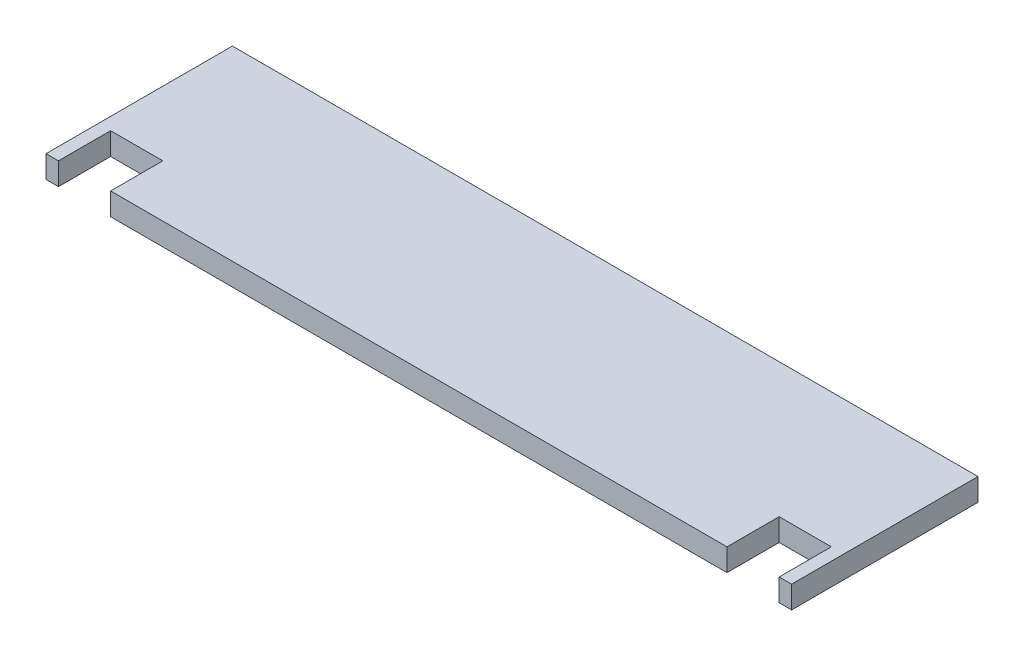
ISO-10303-21;
HEADER;
FILE_DESCRIPTION(('STEP AP214'),'2;1');
FILE_NAME('part.step','',(''),(''),'','','');
FILE_SCHEMA(('AUTOMOTIVE_DESIGN { 1 0 10303 214 1 1 1 1 }'));
ENDSEC;
DATA;
#1=APPLICATION_CONTEXT('core data for automotive mechanical design processes');
#2=APPLICATION_PROTOCOL_DEFINITION('international standard','automotive_design',2000,#1);
#3=PRODUCT_CONTEXT('',#1,'mechanical');
#4=PRODUCT('Part','Part','',(#3));
#5=PRODUCT_RELATED_PRODUCT_CATEGORY('part','',(#4));
#6=PRODUCT_DEFINITION_FORMATION('','',#4);
#7=PRODUCT_DEFINITION_CONTEXT('part definition',#1,'design');
#8=PRODUCT_DEFINITION('design','',#6,#7);
#9=PRODUCT_DEFINITION_SHAPE('','',#8);
#10=(LENGTH_UNIT() NAMED_UNIT(*) SI_UNIT(.MILLI.,.METRE.));
#11=(NAMED_UNIT(*) PLANE_ANGLE_UNIT() SI_UNIT($,.RADIAN.));
#12=(NAMED_UNIT(*) SI_UNIT($,.STERADIAN.) SOLID_ANGLE_UNIT());
#13=UNCERTAINTY_MEASURE_WITH_UNIT(LENGTH_MEASURE(1.E-05),#10,'distance_accuracy_value','');
#14=(GEOMETRIC_REPRESENTATION_CONTEXT(3) GLOBAL_UNCERTAINTY_ASSIGNED_CONTEXT((#13)) GLOBAL_UNIT_ASSIGNED_CONTEXT((#10,
#11,#12)) REPRESENTATION_CONTEXT('',''));
#15=CARTESIAN_POINT('',(0.,0.,0.));
#16=DIRECTION('',(0.,0.,1.));
#17=DIRECTION('',(1.,0.,0.));
#18=AXIS2_PLACEMENT_3D('',#15,#16,#17);
#19=CARTESIAN_POINT('',(-300.,18.,75.));
#20=DIRECTION('',(0.,0.,-1.));
#21=DIRECTION('',(-1.,0.,0.));
#22=AXIS2_PLACEMENT_3D('',#19,#20,#21);
#23=PLANE('',#22);
#24=DIRECTION('',(1.,0.,0.));
#25=VECTOR('',#24,1.);
#26=CARTESIAN_POINT('',(-300.,0.,75.));
#27=LINE('',#26,#25);
#28=CARTESIAN_POINT('',(-300.,0.,75.));
#29=VERTEX_POINT('',#28);
#30=CARTESIAN_POINT('',(-290.,0.,75.));
#31=VERTEX_POINT('',#30);
#32=EDGE_CURVE('E170',#29,#31,#27,.T.);
#33=ORIENTED_EDGE('',*,*,#32,.T.);
#34=DIRECTION('',(0.,1.,0.));
#35=VECTOR('',#34,1.);
#36=CARTESIAN_POINT('',(-290.,-2.,75.));
#37=LINE('',#36,#35);
#38=CARTESIAN_POINT('',(-290.,18.,75.));
#39=VERTEX_POINT('',#38);
#40=EDGE_CURVE('E165',#31,#39,#37,.T.);
#41=ORIENTED_EDGE('',*,*,#40,.T.);
#42=DIRECTION('',(1.,0.,0.));
#43=VECTOR('',#42,1.);
#44=CARTESIAN_POINT('',(-300.,18.,75.));
#45=LINE('',#44,#43);
#46=CARTESIAN_POINT('',(-300.,18.,75.));
#47=VERTEX_POINT('',#46);
#48=EDGE_CURVE('E152',#47,#39,#45,.T.);
#49=ORIENTED_EDGE('',*,*,#48,.F.);
#50=DIRECTION('',(0.,-1.,0.));
#51=VECTOR('',#50,1.);
#52=CARTESIAN_POINT('',(-300.,18.,75.));
#53=LINE('',#52,#51);
#54=EDGE_CURVE('E177',#47,#29,#53,.T.);
#55=ORIENTED_EDGE('',*,*,#54,.T.);
#56=EDGE_LOOP('',(#33,#41,#49,#55));
#57=FACE_BOUND('',#56,.T.);
#58=ADVANCED_FACE('F39',(#57),#23,.F.);
#59=CARTESIAN_POINT('',(-248.,18.,75.));
#60=VERTEX_POINT('',#59);
#61=CARTESIAN_POINT('',(248.,18.,75.));
#62=VERTEX_POINT('',#61);
#63=EDGE_CURVE('E144',#60,#62,#45,.T.);
#64=ORIENTED_EDGE('',*,*,#63,.F.);
#65=DIRECTION('',(0.,1.,0.));
#66=VECTOR('',#65,1.);
#67=CARTESIAN_POINT('',(-248.,-2.,75.));
#68=LINE('',#67,#66);
#69=CARTESIAN_POINT('',(-248.,0.,75.));
#70=VERTEX_POINT('',#69);
#71=EDGE_CURVE('E126',#70,#60,#68,.T.);
#72=ORIENTED_EDGE('',*,*,#71,.F.);
#73=CARTESIAN_POINT('',(248.,0.,75.));
#74=VERTEX_POINT('',#73);
#75=EDGE_CURVE('E174',#70,#74,#27,.T.);
#76=ORIENTED_EDGE('',*,*,#75,.T.);
#77=DIRECTION('',(0.,1.,0.));
#78=VECTOR('',#77,1.);
#79=CARTESIAN_POINT('',(248.,-2.,75.));
#80=LINE('',#79,#78);
#81=EDGE_CURVE('E151',#74,#62,#80,.T.);
#82=ORIENTED_EDGE('',*,*,#81,.T.);
#83=EDGE_LOOP('',(#64,#72,#76,#82));
#84=FACE_BOUND('',#83,.T.);
#85=ADVANCED_FACE('F150',(#84),#23,.F.);
#86=CARTESIAN_POINT('',(300.,18.,-75.));
#87=DIRECTION('',(-1.,0.,0.));
#88=DIRECTION('',(0.,0.,1.));
#89=AXIS2_PLACEMENT_3D('',#86,#87,#88);
#90=PLANE('',#89);
#91=DIRECTION('',(0.,0.,-1.));
#92=VECTOR('',#91,1.);
#93=CARTESIAN_POINT('',(300.,0.,-75.));
#94=LINE('',#93,#92);
#95=CARTESIAN_POINT('',(300.,0.,75.));
#96=VERTEX_POINT('',#95);
#97=CARTESIAN_POINT('',(300.,0.,-75.));
#98=VERTEX_POINT('',#97);
#99=EDGE_CURVE('E161',#96,#98,#94,.T.);
#100=ORIENTED_EDGE('',*,*,#99,.T.);
#101=DIRECTION('',(0.,-1.,0.));
#102=VECTOR('',#101,1.);
#103=CARTESIAN_POINT('',(300.,18.,-75.));
#104=LINE('',#103,#102);
#105=CARTESIAN_POINT('',(300.,18.,-75.));
#106=VERTEX_POINT('',#105);
#107=EDGE_CURVE('E183',#106,#98,#104,.T.);
#108=ORIENTED_EDGE('',*,*,#107,.F.);
#109=DIRECTION('',(0.,0.,-1.));
#110=VECTOR('',#109,1.);
#111=CARTESIAN_POINT('',(300.,18.,-75.));
#112=LINE('',#111,#110);
#113=CARTESIAN_POINT('',(300.,18.,75.));
#114=VERTEX_POINT('',#113);
#115=EDGE_CURVE('E173',#114,#106,#112,.T.);
#116=ORIENTED_EDGE('',*,*,#115,.F.);
#117=DIRECTION('',(0.,-1.,0.));
#118=VECTOR('',#117,1.);
#119=CARTESIAN_POINT('',(300.,18.,75.));
#120=LINE('',#119,#118);
#121=EDGE_CURVE('E156',#114,#96,#120,.T.);
#122=ORIENTED_EDGE('',*,*,#121,.T.);
#123=EDGE_LOOP('',(#100,#108,#116,#122));
#124=FACE_BOUND('',#123,.T.);
#125=ADVANCED_FACE('F41',(#124),#90,.F.);
#126=CARTESIAN_POINT('',(-300.,18.,-75.));
#127=DIRECTION('',(0.,0.,1.));
#128=DIRECTION('',(1.,0.,0.));
#129=AXIS2_PLACEMENT_3D('',#126,#127,#128);
#130=PLANE('',#129);
#131=DIRECTION('',(-1.,0.,0.));
#132=VECTOR('',#131,1.);
#133=CARTESIAN_POINT('',(-300.,0.,-75.));
#134=LINE('',#133,#132);
#135=CARTESIAN_POINT('',(-300.,0.,-75.));
#136=VERTEX_POINT('',#135);
#137=EDGE_CURVE('E164',#98,#136,#134,.T.);
#138=ORIENTED_EDGE('',*,*,#137,.T.);
#139=DIRECTION('',(0.,-1.,0.));
#140=VECTOR('',#139,1.);
#141=CARTESIAN_POINT('',(-300.,18.,-75.));
#142=LINE('',#141,#140);
#143=CARTESIAN_POINT('',(-300.,18.,-75.));
#144=VERTEX_POINT('',#143);
#145=EDGE_CURVE('E180',#144,#136,#142,.T.);
#146=ORIENTED_EDGE('',*,*,#145,.F.);
#147=DIRECTION('',(-1.,0.,0.));
#148=VECTOR('',#147,1.);
#149=CARTESIAN_POINT('',(-300.,18.,-75.));
#150=LINE('',#149,#148);
#151=EDGE_CURVE('E223',#106,#144,#150,.T.);
#152=ORIENTED_EDGE('',*,*,#151,.F.);
#153=ORIENTED_EDGE('',*,*,#107,.T.);
#154=EDGE_LOOP('',(#138,#146,#152,#153));
#155=FACE_BOUND('',#154,.T.);
#156=ADVANCED_FACE('F259',(#155),#130,.F.);
#157=CARTESIAN_POINT('',(-300.,18.,-75.));
#158=DIRECTION('',(1.,0.,0.));
#159=DIRECTION('',(0.,0.,-1.));
#160=AXIS2_PLACEMENT_3D('',#157,#158,#159);
#161=PLANE('',#160);
#162=DIRECTION('',(0.,0.,1.));
#163=VECTOR('',#162,1.);
#164=CARTESIAN_POINT('',(-300.,0.,-75.));
#165=LINE('',#164,#163);
#166=EDGE_CURVE('E167',#136,#29,#165,.T.);
#167=ORIENTED_EDGE('',*,*,#166,.T.);
#168=ORIENTED_EDGE('',*,*,#54,.F.);
#169=DIRECTION('',(0.,0.,1.));
#170=VECTOR('',#169,1.);
#171=CARTESIAN_POINT('',(-300.,18.,-75.));
#172=LINE('',#171,#170);
#173=EDGE_CURVE('E157',#144,#47,#172,.T.);
#174=ORIENTED_EDGE('',*,*,#173,.F.);
#175=ORIENTED_EDGE('',*,*,#145,.T.);
#176=EDGE_LOOP('',(#167,#168,#174,#175));
#177=FACE_BOUND('',#176,.T.);
#178=ADVANCED_FACE('F229',(#177),#161,.F.);
#179=CARTESIAN_POINT('',(290.,18.,75.));
#180=VERTEX_POINT('',#179);
#181=EDGE_CURVE('E153',#180,#114,#45,.T.);
#182=ORIENTED_EDGE('',*,*,#181,.F.);
#183=DIRECTION('',(0.,1.,0.));
#184=VECTOR('',#183,1.);
#185=CARTESIAN_POINT('',(290.,-2.,75.));
#186=LINE('',#185,#184);
#187=CARTESIAN_POINT('',(290.,0.,75.));
#188=VERTEX_POINT('',#187);
#189=EDGE_CURVE('E210',#188,#180,#186,.T.);
#190=ORIENTED_EDGE('',*,*,#189,.F.);
#191=EDGE_CURVE('E169',#188,#96,#27,.T.);
#192=ORIENTED_EDGE('',*,*,#191,.T.);
#193=ORIENTED_EDGE('',*,*,#121,.F.);
#194=EDGE_LOOP('',(#182,#190,#192,#193));
#195=FACE_BOUND('',#194,.T.);
#196=ADVANCED_FACE('F246',(#195),#23,.F.);
#197=CARTESIAN_POINT('',(0.,18.,0.));
#198=DIRECTION('',(0.,1.,0.));
#199=DIRECTION('',(0.,0.,1.));
#200=AXIS2_PLACEMENT_3D('',#197,#198,#199);
#201=PLANE('',#200);
#202=DIRECTION('',(0.,0.,1.));
#203=VECTOR('',#202,1.);
#204=CARTESIAN_POINT('',(-290.,18.,33.));
#205=LINE('',#204,#203);
#206=CARTESIAN_POINT('',(-290.,18.,33.));
#207=VERTEX_POINT('',#206);
#208=EDGE_CURVE('E137',#207,#39,#205,.T.);
#209=ORIENTED_EDGE('',*,*,#208,.F.);
#210=DIRECTION('',(-1.,0.,0.));
#211=VECTOR('',#210,1.);
#212=CARTESIAN_POINT('',(-290.,18.,33.));
#213=LINE('',#212,#211);
#214=CARTESIAN_POINT('',(-248.,18.,33.));
#215=VERTEX_POINT('',#214);
#216=EDGE_CURVE('E146',#215,#207,#213,.T.);
#217=ORIENTED_EDGE('',*,*,#216,.F.);
#218=DIRECTION('',(0.,0.,-1.));
#219=VECTOR('',#218,1.);
#220=CARTESIAN_POINT('',(-248.,18.,33.));
#221=LINE('',#220,#219);
#222=EDGE_CURVE('E129',#60,#215,#221,.T.);
#223=ORIENTED_EDGE('',*,*,#222,.F.);
#224=ORIENTED_EDGE('',*,*,#63,.T.);
#225=DIRECTION('',(0.,0.,1.));
#226=VECTOR('',#225,1.);
#227=CARTESIAN_POINT('',(248.,18.,33.));
#228=LINE('',#227,#226);
#229=CARTESIAN_POINT('',(248.,18.,33.));
#230=VERTEX_POINT('',#229);
#231=EDGE_CURVE('E212',#230,#62,#228,.T.);
#232=ORIENTED_EDGE('',*,*,#231,.F.);
#233=DIRECTION('',(-1.,0.,0.));
#234=VECTOR('',#233,1.);
#235=CARTESIAN_POINT('',(290.,18.,33.));
#236=LINE('',#235,#234);
#237=CARTESIAN_POINT('',(290.,18.,33.));
#238=VERTEX_POINT('',#237);
#239=EDGE_CURVE('E218',#238,#230,#236,.T.);
#240=ORIENTED_EDGE('',*,*,#239,.F.);
#241=DIRECTION('',(0.,0.,-1.));
#242=VECTOR('',#241,1.);
#243=CARTESIAN_POINT('',(290.,18.,33.));
#244=LINE('',#243,#242);
#245=EDGE_CURVE('E147',#180,#238,#244,.T.);
#246=ORIENTED_EDGE('',*,*,#245,.F.);
#247=ORIENTED_EDGE('',*,*,#181,.T.);
#248=ORIENTED_EDGE('',*,*,#115,.T.);
#249=ORIENTED_EDGE('',*,*,#151,.T.);
#250=ORIENTED_EDGE('',*,*,#173,.T.);
#251=ORIENTED_EDGE('',*,*,#48,.T.);
#252=EDGE_LOOP('',(#209,#217,#223,#224,#232,#240,#246,#247,#248,#249,#250,#251));
#253=FACE_BOUND('',#252,.T.);
#254=ADVANCED_FACE('F142',(#253),#201,.T.);
#255=CARTESIAN_POINT('',(0.,0.,0.));
#256=DIRECTION('',(0.,1.,0.));
#257=DIRECTION('',(0.,0.,1.));
#258=AXIS2_PLACEMENT_3D('',#255,#256,#257);
#259=PLANE('',#258);
#260=DIRECTION('',(-1.,0.,0.));
#261=VECTOR('',#260,1.);
#262=CARTESIAN_POINT('',(0.,0.,33.));
#263=LINE('',#262,#261);
#264=CARTESIAN_POINT('',(-248.,0.,33.));
#265=VERTEX_POINT('',#264);
#266=CARTESIAN_POINT('',(-290.,0.,33.));
#267=VERTEX_POINT('',#266);
#268=EDGE_CURVE('E47',#265,#267,#263,.T.);
#269=ORIENTED_EDGE('',*,*,#268,.T.);
#270=DIRECTION('',(0.,0.,1.));
#271=VECTOR('',#270,1.);
#272=CARTESIAN_POINT('',(-290.,0.,0.));
#273=LINE('',#272,#271);
#274=EDGE_CURVE('E11',#267,#31,#273,.T.);
#275=ORIENTED_EDGE('',*,*,#274,.T.);
#276=ORIENTED_EDGE('',*,*,#32,.F.);
#277=ORIENTED_EDGE('',*,*,#166,.F.);
#278=ORIENTED_EDGE('',*,*,#137,.F.);
#279=ORIENTED_EDGE('',*,*,#99,.F.);
#280=ORIENTED_EDGE('',*,*,#191,.F.);
#281=DIRECTION('',(0.,0.,-1.));
#282=VECTOR('',#281,1.);
#283=CARTESIAN_POINT('',(290.,0.,0.));
#284=LINE('',#283,#282);
#285=CARTESIAN_POINT('',(290.,0.,33.));
#286=VERTEX_POINT('',#285);
#287=EDGE_CURVE('E186',#188,#286,#284,.T.);
#288=ORIENTED_EDGE('',*,*,#287,.T.);
#289=DIRECTION('',(-1.,0.,0.));
#290=VECTOR('',#289,1.);
#291=CARTESIAN_POINT('',(0.,0.,33.));
#292=LINE('',#291,#290);
#293=CARTESIAN_POINT('',(248.,0.,33.));
#294=VERTEX_POINT('',#293);
#295=EDGE_CURVE('E189',#286,#294,#292,.T.);
#296=ORIENTED_EDGE('',*,*,#295,.T.);
#297=DIRECTION('',(0.,0.,1.));
#298=VECTOR('',#297,1.);
#299=CARTESIAN_POINT('',(248.,0.,1.63890065539904E-13));
#300=LINE('',#299,#298);
#301=EDGE_CURVE('E192',#294,#74,#300,.T.);
#302=ORIENTED_EDGE('',*,*,#301,.T.);
#303=ORIENTED_EDGE('',*,*,#75,.F.);
#304=DIRECTION('',(0.,0.,-1.));
#305=VECTOR('',#304,1.);
#306=CARTESIAN_POINT('',(-248.,0.,0.));
#307=LINE('',#306,#305);
#308=EDGE_CURVE('E132',#70,#265,#307,.T.);
#309=ORIENTED_EDGE('',*,*,#308,.T.);
#310=EDGE_LOOP('',(#269,#275,#276,#277,#278,#279,#280,#288,#296,#302,#303,#309));
#311=FACE_BOUND('',#310,.T.);
#312=ADVANCED_FACE('F197',(#311),#259,.F.);
#313=CARTESIAN_POINT('',(248.,-2.,33.));
#314=DIRECTION('',(-1.,0.,0.));
#315=DIRECTION('',(0.,0.,1.));
#316=AXIS2_PLACEMENT_3D('',#313,#314,#315);
#317=PLANE('',#316);
#318=DIRECTION('',(0.,1.,0.));
#319=VECTOR('',#318,1.);
#320=CARTESIAN_POINT('',(248.,-2.,33.));
#321=LINE('',#320,#319);
#322=EDGE_CURVE('E214',#294,#230,#321,.T.);
#323=ORIENTED_EDGE('',*,*,#322,.T.);
#324=ORIENTED_EDGE('',*,*,#231,.T.);
#325=ORIENTED_EDGE('',*,*,#81,.F.);
#326=ORIENTED_EDGE('',*,*,#301,.F.);
#327=EDGE_LOOP('',(#323,#324,#325,#326));
#328=FACE_BOUND('',#327,.T.);
#329=ADVANCED_FACE('F271',(#328),#317,.F.);
#330=CARTESIAN_POINT('',(290.,-2.,33.));
#331=DIRECTION('',(0.,0.,-1.));
#332=DIRECTION('',(-1.,0.,0.));
#333=AXIS2_PLACEMENT_3D('',#330,#331,#332);
#334=PLANE('',#333);
#335=DIRECTION('',(0.,1.,0.));
#336=VECTOR('',#335,1.);
#337=CARTESIAN_POINT('',(290.,-2.,33.));
#338=LINE('',#337,#336);
#339=EDGE_CURVE('E62',#286,#238,#338,.T.);
#340=ORIENTED_EDGE('',*,*,#339,.T.);
#341=ORIENTED_EDGE('',*,*,#239,.T.);
#342=ORIENTED_EDGE('',*,*,#322,.F.);
#343=ORIENTED_EDGE('',*,*,#295,.F.);
#344=EDGE_LOOP('',(#340,#341,#342,#343));
#345=FACE_BOUND('',#344,.T.);
#346=ADVANCED_FACE('F242',(#345),#334,.F.);
#347=CARTESIAN_POINT('',(290.,-2.,33.));
#348=DIRECTION('',(1.,0.,0.));
#349=DIRECTION('',(0.,0.,-1.));
#350=AXIS2_PLACEMENT_3D('',#347,#348,#349);
#351=PLANE('',#350);
#352=ORIENTED_EDGE('',*,*,#189,.T.);
#353=ORIENTED_EDGE('',*,*,#245,.T.);
#354=ORIENTED_EDGE('',*,*,#339,.F.);
#355=ORIENTED_EDGE('',*,*,#287,.F.);
#356=EDGE_LOOP('',(#352,#353,#354,#355));
#357=FACE_BOUND('',#356,.T.);
#358=ADVANCED_FACE('F235',(#357),#351,.F.);
#359=CARTESIAN_POINT('',(-290.,-2.,33.));
#360=DIRECTION('',(-1.,0.,0.));
#361=DIRECTION('',(0.,0.,1.));
#362=AXIS2_PLACEMENT_3D('',#359,#360,#361);
#363=PLANE('',#362);
#364=DIRECTION('',(0.,1.,0.));
#365=VECTOR('',#364,1.);
#366=CARTESIAN_POINT('',(-290.,-2.,33.));
#367=LINE('',#366,#365);
#368=EDGE_CURVE('E202',#267,#207,#367,.T.);
#369=ORIENTED_EDGE('',*,*,#368,.T.);
#370=ORIENTED_EDGE('',*,*,#208,.T.);
#371=ORIENTED_EDGE('',*,*,#40,.F.);
#372=ORIENTED_EDGE('',*,*,#274,.F.);
#373=EDGE_LOOP('',(#369,#370,#371,#372));
#374=FACE_BOUND('',#373,.T.);
#375=ADVANCED_FACE('F232',(#374),#363,.F.);
#376=CARTESIAN_POINT('',(-290.,-2.,33.));
#377=DIRECTION('',(0.,0.,-1.));
#378=DIRECTION('',(-1.,0.,0.));
#379=AXIS2_PLACEMENT_3D('',#376,#377,#378);
#380=PLANE('',#379);
#381=DIRECTION('',(0.,1.,0.));
#382=VECTOR('',#381,1.);
#383=CARTESIAN_POINT('',(-248.,-2.,33.));
#384=LINE('',#383,#382);
#385=EDGE_CURVE('E54',#265,#215,#384,.T.);
#386=ORIENTED_EDGE('',*,*,#385,.T.);
#387=ORIENTED_EDGE('',*,*,#216,.T.);
#388=ORIENTED_EDGE('',*,*,#368,.F.);
#389=ORIENTED_EDGE('',*,*,#268,.F.);
#390=EDGE_LOOP('',(#386,#387,#388,#389));
#391=FACE_BOUND('',#390,.T.);
#392=ADVANCED_FACE('F201',(#391),#380,.F.);
#393=CARTESIAN_POINT('',(-248.,-2.,33.));
#394=DIRECTION('',(1.,0.,0.));
#395=DIRECTION('',(0.,0.,-1.));
#396=AXIS2_PLACEMENT_3D('',#393,#394,#395);
#397=PLANE('',#396);
#398=ORIENTED_EDGE('',*,*,#71,.T.);
#399=ORIENTED_EDGE('',*,*,#222,.T.);
#400=ORIENTED_EDGE('',*,*,#385,.F.);
#401=ORIENTED_EDGE('',*,*,#308,.F.);
#402=EDGE_LOOP('',(#398,#399,#400,#401));
#403=FACE_BOUND('',#402,.T.);
#404=ADVANCED_FACE('F128',(#403),#397,.F.);
#405=CLOSED_SHELL('',(#58,#85,#125,#156,#178,#196,#254,#312,#329,#346,#358,#375,#392,#404));
#406=MANIFOLD_SOLID_BREP('B2',#405);
#407=ADVANCED_BREP_SHAPE_REPRESENTATION('',(#18,#406),#14);
#408=SHAPE_DEFINITION_REPRESENTATION(#9,#407);
ENDSEC;
END-ISO-10303-21;
